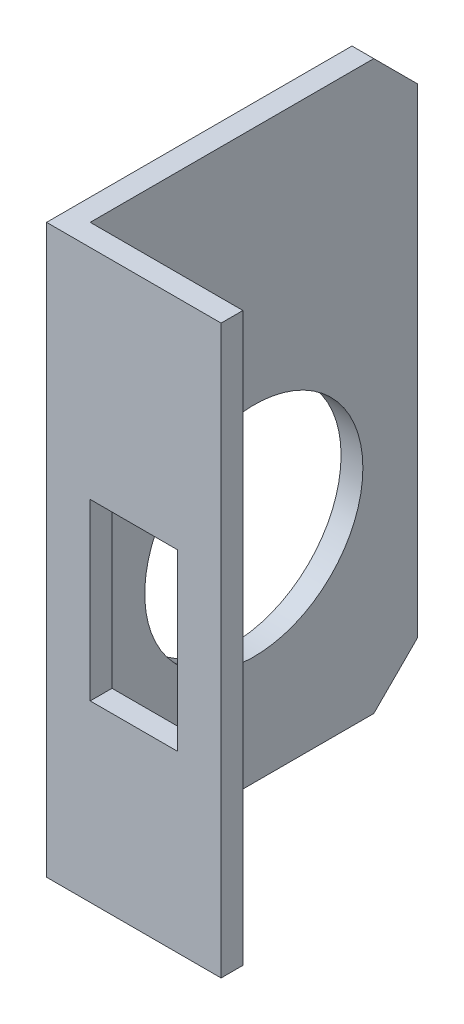
ISO-10303-21;
HEADER;
FILE_DESCRIPTION(('STEP AP214'),'2;1');
FILE_NAME('part.step','',(''),(''),'','','');
FILE_SCHEMA(('AUTOMOTIVE_DESIGN { 1 0 10303 214 1 1 1 1 }'));
ENDSEC;
DATA;
#1=APPLICATION_CONTEXT('core data for automotive mechanical design processes');
#2=APPLICATION_PROTOCOL_DEFINITION('international standard','automotive_design',2000,#1);
#3=PRODUCT_CONTEXT('',#1,'mechanical');
#4=PRODUCT('Part','Part','',(#3));
#5=PRODUCT_RELATED_PRODUCT_CATEGORY('part','',(#4));
#6=PRODUCT_DEFINITION_FORMATION('','',#4);
#7=PRODUCT_DEFINITION_CONTEXT('part definition',#1,'design');
#8=PRODUCT_DEFINITION('design','',#6,#7);
#9=PRODUCT_DEFINITION_SHAPE('','',#8);
#10=(LENGTH_UNIT() NAMED_UNIT(*) SI_UNIT(.MILLI.,.METRE.));
#11=(NAMED_UNIT(*) PLANE_ANGLE_UNIT() SI_UNIT($,.RADIAN.));
#12=(NAMED_UNIT(*) SI_UNIT($,.STERADIAN.) SOLID_ANGLE_UNIT());
#13=UNCERTAINTY_MEASURE_WITH_UNIT(LENGTH_MEASURE(1.E-05),#10,'distance_accuracy_value','');
#14=(GEOMETRIC_REPRESENTATION_CONTEXT(3) GLOBAL_UNCERTAINTY_ASSIGNED_CONTEXT((#13)) GLOBAL_UNIT_ASSIGNED_CONTEXT((#10,
#11,#12)) REPRESENTATION_CONTEXT('',''));
#15=CARTESIAN_POINT('',(0.,0.,0.));
#16=DIRECTION('',(0.,0.,1.));
#17=DIRECTION('',(1.,0.,0.));
#18=AXIS2_PLACEMENT_3D('',#15,#16,#17);
#19=CARTESIAN_POINT('',(0.,-38.1,-1.5875));
#20=DIRECTION('',(0.,0.,-1.));
#21=DIRECTION('',(-1.,0.,0.));
#22=AXIS2_PLACEMENT_3D('',#19,#20,#21);
#23=PLANE('',#22);
#24=DIRECTION('',(1.,0.,0.));
#25=VECTOR('',#24,1.);
#26=CARTESIAN_POINT('',(6.35000000000001,-12.7,-1.5875));
#27=LINE('',#26,#25);
#28=CARTESIAN_POINT('',(-6.35,-12.7,-1.5875));
#29=VERTEX_POINT('',#28);
#30=CARTESIAN_POINT('',(6.35,-12.7,-1.5875));
#31=VERTEX_POINT('',#30);
#32=EDGE_CURVE('E142',#29,#31,#27,.T.);
#33=ORIENTED_EDGE('',*,*,#32,.T.);
#34=DIRECTION('',(0.,1.,0.));
#35=VECTOR('',#34,1.);
#36=CARTESIAN_POINT('',(6.35,12.7,-1.5875));
#37=LINE('',#36,#35);
#38=CARTESIAN_POINT('',(6.35,12.7,-1.5875));
#39=VERTEX_POINT('',#38);
#40=EDGE_CURVE('E129',#31,#39,#37,.T.);
#41=ORIENTED_EDGE('',*,*,#40,.T.);
#42=DIRECTION('',(-1.,0.,0.));
#43=VECTOR('',#42,1.);
#44=CARTESIAN_POINT('',(6.35,12.7,-1.5875));
#45=LINE('',#44,#43);
#46=CARTESIAN_POINT('',(-6.35,12.7,-1.5875));
#47=VERTEX_POINT('',#46);
#48=EDGE_CURVE('E159',#39,#47,#45,.T.);
#49=ORIENTED_EDGE('',*,*,#48,.T.);
#50=DIRECTION('',(0.,-1.,0.));
#51=VECTOR('',#50,1.);
#52=CARTESIAN_POINT('',(-6.35,12.7,-1.5875));
#53=LINE('',#52,#51);
#54=EDGE_CURVE('E149',#47,#29,#53,.T.);
#55=ORIENTED_EDGE('',*,*,#54,.T.);
#56=EDGE_LOOP('',(#33,#41,#49,#55));
#57=FACE_BOUND('',#56,.T.);
#58=DIRECTION('',(0.,1.,0.));
#59=VECTOR('',#58,1.);
#60=CARTESIAN_POINT('',(-9.525,-38.1,-1.5875));
#61=LINE('',#60,#59);
#62=CARTESIAN_POINT('',(-9.525,-38.1,-1.5875));
#63=VERTEX_POINT('',#62);
#64=CARTESIAN_POINT('',(-9.525,44.45,-1.5875));
#65=VERTEX_POINT('',#64);
#66=EDGE_CURVE('E42',#63,#65,#61,.T.);
#67=ORIENTED_EDGE('',*,*,#66,.T.);
#68=DIRECTION('',(-1.,0.,0.));
#69=VECTOR('',#68,1.);
#70=CARTESIAN_POINT('',(0.,44.45,-1.5875));
#71=LINE('',#70,#69);
#72=CARTESIAN_POINT('',(12.7,44.45,-1.5875));
#73=VERTEX_POINT('',#72);
#74=EDGE_CURVE('E172',#73,#65,#71,.T.);
#75=ORIENTED_EDGE('',*,*,#74,.F.);
#76=DIRECTION('',(0.,1.,0.));
#77=VECTOR('',#76,1.);
#78=CARTESIAN_POINT('',(12.7,-38.1,-1.5875));
#79=LINE('',#78,#77);
#80=CARTESIAN_POINT('',(12.7,-38.1,-1.5875));
#81=VERTEX_POINT('',#80);
#82=EDGE_CURVE('E11',#81,#73,#79,.T.);
#83=ORIENTED_EDGE('',*,*,#82,.F.);
#84=DIRECTION('',(-1.,0.,0.));
#85=VECTOR('',#84,1.);
#86=CARTESIAN_POINT('',(0.,-38.1,-1.5875));
#87=LINE('',#86,#85);
#88=EDGE_CURVE('E203',#81,#63,#87,.T.);
#89=ORIENTED_EDGE('',*,*,#88,.T.);
#90=EDGE_LOOP('',(#67,#75,#83,#89));
#91=FACE_BOUND('',#90,.T.);
#92=ADVANCED_FACE('F39',(#57,#91),#23,.T.);
#93=CARTESIAN_POINT('',(12.7,-38.1,0.));
#94=DIRECTION('',(-1.,0.,0.));
#95=DIRECTION('',(0.,0.,1.));
#96=AXIS2_PLACEMENT_3D('',#93,#94,#95);
#97=PLANE('',#96);
#98=ORIENTED_EDGE('',*,*,#82,.T.);
#99=DIRECTION('',(0.,0.,1.));
#100=VECTOR('',#99,1.);
#101=CARTESIAN_POINT('',(12.7,44.45,0.));
#102=LINE('',#101,#100);
#103=CARTESIAN_POINT('',(12.7,44.45,1.5875));
#104=VERTEX_POINT('',#103);
#105=EDGE_CURVE('E200',#73,#104,#102,.T.);
#106=ORIENTED_EDGE('',*,*,#105,.T.);
#107=DIRECTION('',(0.,1.,0.));
#108=VECTOR('',#107,1.);
#109=CARTESIAN_POINT('',(12.7,-38.1,1.5875));
#110=LINE('',#109,#108);
#111=CARTESIAN_POINT('',(12.7,-38.1,1.5875));
#112=VERTEX_POINT('',#111);
#113=EDGE_CURVE('E47',#112,#104,#110,.T.);
#114=ORIENTED_EDGE('',*,*,#113,.F.);
#115=DIRECTION('',(0.,0.,1.));
#116=VECTOR('',#115,1.);
#117=CARTESIAN_POINT('',(12.7,-38.1,0.));
#118=LINE('',#117,#116);
#119=EDGE_CURVE('E213',#81,#112,#118,.T.);
#120=ORIENTED_EDGE('',*,*,#119,.F.);
#121=EDGE_LOOP('',(#98,#106,#114,#120));
#122=FACE_BOUND('',#121,.T.);
#123=ADVANCED_FACE('F240',(#122),#97,.F.);
#124=CARTESIAN_POINT('',(0.,-38.1,1.5875));
#125=DIRECTION('',(0.,0.,-1.));
#126=DIRECTION('',(-1.,0.,0.));
#127=AXIS2_PLACEMENT_3D('',#124,#125,#126);
#128=PLANE('',#127);
#129=DIRECTION('',(0.,1.,0.));
#130=VECTOR('',#129,1.);
#131=CARTESIAN_POINT('',(6.35,12.7,1.5875));
#132=LINE('',#131,#130);
#133=CARTESIAN_POINT('',(6.35,-12.7,1.5875));
#134=VERTEX_POINT('',#133);
#135=CARTESIAN_POINT('',(6.35,12.7,1.5875));
#136=VERTEX_POINT('',#135);
#137=EDGE_CURVE('E151',#134,#136,#132,.T.);
#138=ORIENTED_EDGE('',*,*,#137,.F.);
#139=DIRECTION('',(1.,0.,0.));
#140=VECTOR('',#139,1.);
#141=CARTESIAN_POINT('',(6.35,-12.7,1.5875));
#142=LINE('',#141,#140);
#143=CARTESIAN_POINT('',(-6.35,-12.7,1.5875));
#144=VERTEX_POINT('',#143);
#145=EDGE_CURVE('E145',#144,#134,#142,.T.);
#146=ORIENTED_EDGE('',*,*,#145,.F.);
#147=DIRECTION('',(0.,-1.,0.));
#148=VECTOR('',#147,1.);
#149=CARTESIAN_POINT('',(-6.35,12.7,1.5875));
#150=LINE('',#149,#148);
#151=CARTESIAN_POINT('',(-6.35,12.7,1.5875));
#152=VERTEX_POINT('',#151);
#153=EDGE_CURVE('E155',#152,#144,#150,.T.);
#154=ORIENTED_EDGE('',*,*,#153,.F.);
#155=DIRECTION('',(-1.,0.,0.));
#156=VECTOR('',#155,1.);
#157=CARTESIAN_POINT('',(6.35,12.7,1.5875));
#158=LINE('',#157,#156);
#159=EDGE_CURVE('E63',#136,#152,#158,.T.);
#160=ORIENTED_EDGE('',*,*,#159,.F.);
#161=EDGE_LOOP('',(#138,#146,#154,#160));
#162=FACE_BOUND('',#161,.T.);
#163=ORIENTED_EDGE('',*,*,#113,.T.);
#164=DIRECTION('',(-1.,0.,0.));
#165=VECTOR('',#164,1.);
#166=CARTESIAN_POINT('',(0.,44.45,1.5875));
#167=LINE('',#166,#165);
#168=CARTESIAN_POINT('',(-12.7,44.45,1.5875));
#169=VERTEX_POINT('',#168);
#170=EDGE_CURVE('E197',#104,#169,#167,.T.);
#171=ORIENTED_EDGE('',*,*,#170,.T.);
#172=DIRECTION('',(0.,1.,0.));
#173=VECTOR('',#172,1.);
#174=CARTESIAN_POINT('',(-12.7,-38.1,1.5875));
#175=LINE('',#174,#173);
#176=CARTESIAN_POINT('',(-12.7,-38.1,1.5875));
#177=VERTEX_POINT('',#176);
#178=EDGE_CURVE('E216',#177,#169,#175,.T.);
#179=ORIENTED_EDGE('',*,*,#178,.F.);
#180=DIRECTION('',(-1.,0.,0.));
#181=VECTOR('',#180,1.);
#182=CARTESIAN_POINT('',(0.,-38.1,1.5875));
#183=LINE('',#182,#181);
#184=EDGE_CURVE('E210',#112,#177,#183,.T.);
#185=ORIENTED_EDGE('',*,*,#184,.F.);
#186=EDGE_LOOP('',(#163,#171,#179,#185));
#187=FACE_BOUND('',#186,.T.);
#188=ADVANCED_FACE('F259',(#162,#187),#128,.F.);
#189=CARTESIAN_POINT('',(-12.7,-38.1,0.));
#190=DIRECTION('',(-1.,0.,0.));
#191=DIRECTION('',(0.,0.,1.));
#192=AXIS2_PLACEMENT_3D('',#189,#190,#191);
#193=PLANE('',#192);
#194=CARTESIAN_POINT('',(-12.7,-6.35,-25.4));
#195=DIRECTION('',(-1.,0.,0.));
#196=DIRECTION('',(0.,0.,1.));
#197=AXIS2_PLACEMENT_3D('',#194,#195,#196);
#198=CIRCLE('',#197,15.875);
#199=CARTESIAN_POINT('',(-12.7,-6.35,-41.275));
#200=VERTEX_POINT('',#199);
#201=EDGE_CURVE('E168',#200,#200,#198,.F.);
#202=ORIENTED_EDGE('',*,*,#201,.T.);
#203=EDGE_LOOP('',(#202));
#204=FACE_BOUND('',#203,.T.);
#205=DIRECTION('',(0.,-0.707106781186548,-0.707106781186548));
#206=VECTOR('',#205,1.);
#207=CARTESIAN_POINT('',(-12.7,38.1,-49.2125));
#208=LINE('',#207,#206);
#209=CARTESIAN_POINT('',(-12.7,44.45,-42.8625));
#210=VERTEX_POINT('',#209);
#211=CARTESIAN_POINT('',(-12.7,38.1,-49.2125));
#212=VERTEX_POINT('',#211);
#213=EDGE_CURVE('E175',#210,#212,#208,.T.);
#214=ORIENTED_EDGE('',*,*,#213,.T.);
#215=DIRECTION('',(0.,1.,0.));
#216=VECTOR('',#215,1.);
#217=CARTESIAN_POINT('',(-12.7,-38.1,-49.2125));
#218=LINE('',#217,#216);
#219=CARTESIAN_POINT('',(-12.7,-31.75,-49.2125));
#220=VERTEX_POINT('',#219);
#221=EDGE_CURVE('E219',#220,#212,#218,.T.);
#222=ORIENTED_EDGE('',*,*,#221,.F.);
#223=DIRECTION('',(0.,-0.707106781186548,0.707106781186547));
#224=VECTOR('',#223,1.);
#225=CARTESIAN_POINT('',(-12.7,-31.75,-49.2125));
#226=LINE('',#225,#224);
#227=CARTESIAN_POINT('',(-12.7,-38.1,-42.8625));
#228=VERTEX_POINT('',#227);
#229=EDGE_CURVE('E185',#220,#228,#226,.T.);
#230=ORIENTED_EDGE('',*,*,#229,.T.);
#231=DIRECTION('',(0.,0.,1.));
#232=VECTOR('',#231,1.);
#233=CARTESIAN_POINT('',(-12.7,-38.1,0.));
#234=LINE('',#233,#232);
#235=EDGE_CURVE('E208',#228,#177,#234,.T.);
#236=ORIENTED_EDGE('',*,*,#235,.T.);
#237=ORIENTED_EDGE('',*,*,#178,.T.);
#238=DIRECTION('',(0.,0.,1.));
#239=VECTOR('',#238,1.);
#240=CARTESIAN_POINT('',(-12.7,44.45,0.));
#241=LINE('',#240,#239);
#242=EDGE_CURVE('E195',#210,#169,#241,.T.);
#243=ORIENTED_EDGE('',*,*,#242,.F.);
#244=EDGE_LOOP('',(#214,#222,#230,#236,#237,#243));
#245=FACE_BOUND('',#244,.T.);
#246=ADVANCED_FACE('F256',(#204,#245),#193,.T.);
#247=CARTESIAN_POINT('',(-1.07552855510562E-13,-38.1,-49.2125));
#248=DIRECTION('',(0.,0.,-1.));
#249=DIRECTION('',(-1.,0.,0.));
#250=AXIS2_PLACEMENT_3D('',#247,#248,#249);
#251=PLANE('',#250);
#252=DIRECTION('',(1.,0.,0.));
#253=VECTOR('',#252,1.);
#254=CARTESIAN_POINT('',(-57.6012806053458,38.1,-49.2125));
#255=LINE('',#254,#253);
#256=CARTESIAN_POINT('',(-9.525,38.1,-49.2125));
#257=VERTEX_POINT('',#256);
#258=EDGE_CURVE('E176',#212,#257,#255,.T.);
#259=ORIENTED_EDGE('',*,*,#258,.T.);
#260=DIRECTION('',(0.,1.,0.));
#261=VECTOR('',#260,1.);
#262=CARTESIAN_POINT('',(-9.52500000000001,-38.1,-49.2125));
#263=LINE('',#262,#261);
#264=CARTESIAN_POINT('',(-9.525,-31.75,-49.2125));
#265=VERTEX_POINT('',#264);
#266=EDGE_CURVE('E221',#265,#257,#263,.T.);
#267=ORIENTED_EDGE('',*,*,#266,.F.);
#268=DIRECTION('',(1.,0.,0.));
#269=VECTOR('',#268,1.);
#270=CARTESIAN_POINT('',(-57.6012806053458,-31.75,-49.2125));
#271=LINE('',#270,#269);
#272=EDGE_CURVE('E186',#220,#265,#271,.T.);
#273=ORIENTED_EDGE('',*,*,#272,.F.);
#274=ORIENTED_EDGE('',*,*,#221,.T.);
#275=EDGE_LOOP('',(#259,#267,#273,#274));
#276=FACE_BOUND('',#275,.T.);
#277=ADVANCED_FACE('F250',(#276),#251,.T.);
#278=CARTESIAN_POINT('',(-9.525,-38.1,0.));
#279=DIRECTION('',(-1.,0.,0.));
#280=DIRECTION('',(0.,0.,1.));
#281=AXIS2_PLACEMENT_3D('',#278,#279,#280);
#282=PLANE('',#281);
#283=CARTESIAN_POINT('',(-9.525,-6.35,-25.4));
#284=DIRECTION('',(1.,0.,0.));
#285=DIRECTION('',(0.,0.,-1.));
#286=AXIS2_PLACEMENT_3D('',#283,#284,#285);
#287=CIRCLE('',#286,15.875);
#288=CARTESIAN_POINT('',(-9.52500000000001,-6.35,-41.275));
#289=VERTEX_POINT('',#288);
#290=EDGE_CURVE('E165',#289,#289,#287,.T.);
#291=ORIENTED_EDGE('',*,*,#290,.F.);
#292=EDGE_LOOP('',(#291));
#293=FACE_BOUND('',#292,.T.);
#294=ORIENTED_EDGE('',*,*,#266,.T.);
#295=DIRECTION('',(0.,-0.707106781186547,-0.707106781186547));
#296=VECTOR('',#295,1.);
#297=CARTESIAN_POINT('',(-9.525,38.1,-49.2125));
#298=LINE('',#297,#296);
#299=CARTESIAN_POINT('',(-9.525,44.45,-42.8625));
#300=VERTEX_POINT('',#299);
#301=EDGE_CURVE('E169',#300,#257,#298,.T.);
#302=ORIENTED_EDGE('',*,*,#301,.F.);
#303=DIRECTION('',(0.,0.,1.));
#304=VECTOR('',#303,1.);
#305=CARTESIAN_POINT('',(-9.525,44.45,0.));
#306=LINE('',#305,#304);
#307=EDGE_CURVE('E193',#300,#65,#306,.T.);
#308=ORIENTED_EDGE('',*,*,#307,.T.);
#309=ORIENTED_EDGE('',*,*,#66,.F.);
#310=DIRECTION('',(0.,0.,1.));
#311=VECTOR('',#310,1.);
#312=CARTESIAN_POINT('',(-9.525,-38.1,0.));
#313=LINE('',#312,#311);
#314=CARTESIAN_POINT('',(-9.525,-38.1,-42.8625));
#315=VERTEX_POINT('',#314);
#316=EDGE_CURVE('E206',#315,#63,#313,.T.);
#317=ORIENTED_EDGE('',*,*,#316,.F.);
#318=DIRECTION('',(0.,-0.707106781186548,0.707106781186547));
#319=VECTOR('',#318,1.);
#320=CARTESIAN_POINT('',(-9.525,-31.75,-49.2125));
#321=LINE('',#320,#319);
#322=EDGE_CURVE('E179',#265,#315,#321,.T.);
#323=ORIENTED_EDGE('',*,*,#322,.F.);
#324=EDGE_LOOP('',(#294,#302,#308,#309,#317,#323));
#325=FACE_BOUND('',#324,.T.);
#326=ADVANCED_FACE('F246',(#293,#325),#282,.F.);
#327=CARTESIAN_POINT('',(0.,-38.1,0.));
#328=DIRECTION('',(0.,1.,0.));
#329=DIRECTION('',(0.,0.,1.));
#330=AXIS2_PLACEMENT_3D('',#327,#328,#329);
#331=PLANE('',#330);
#332=ORIENTED_EDGE('',*,*,#235,.F.);
#333=DIRECTION('',(1.,0.,0.));
#334=VECTOR('',#333,1.);
#335=CARTESIAN_POINT('',(-57.6012806053458,-38.1,-42.8625));
#336=LINE('',#335,#334);
#337=EDGE_CURVE('E164',#228,#315,#336,.T.);
#338=ORIENTED_EDGE('',*,*,#337,.T.);
#339=ORIENTED_EDGE('',*,*,#316,.T.);
#340=ORIENTED_EDGE('',*,*,#88,.F.);
#341=ORIENTED_EDGE('',*,*,#119,.T.);
#342=ORIENTED_EDGE('',*,*,#184,.T.);
#343=EDGE_LOOP('',(#332,#338,#339,#340,#341,#342));
#344=FACE_BOUND('',#343,.T.);
#345=ADVANCED_FACE('F245',(#344),#331,.F.);
#346=CARTESIAN_POINT('',(0.,44.45,0.));
#347=DIRECTION('',(0.,1.,0.));
#348=DIRECTION('',(0.,0.,1.));
#349=AXIS2_PLACEMENT_3D('',#346,#347,#348);
#350=PLANE('',#349);
#351=DIRECTION('',(1.,0.,0.));
#352=VECTOR('',#351,1.);
#353=CARTESIAN_POINT('',(-57.6012806053458,44.45,-42.8625));
#354=LINE('',#353,#352);
#355=EDGE_CURVE('E173',#210,#300,#354,.T.);
#356=ORIENTED_EDGE('',*,*,#355,.F.);
#357=ORIENTED_EDGE('',*,*,#242,.T.);
#358=ORIENTED_EDGE('',*,*,#170,.F.);
#359=ORIENTED_EDGE('',*,*,#105,.F.);
#360=ORIENTED_EDGE('',*,*,#74,.T.);
#361=ORIENTED_EDGE('',*,*,#307,.F.);
#362=EDGE_LOOP('',(#356,#357,#358,#359,#360,#361));
#363=FACE_BOUND('',#362,.T.);
#364=ADVANCED_FACE('F236',(#363),#350,.T.);
#365=CARTESIAN_POINT('',(-57.6012806053458,38.1,-49.2125));
#366=DIRECTION('',(0.,-0.707106781186548,0.707106781186548));
#367=DIRECTION('',(0.,-0.707106781186548,-0.707106781186548));
#368=AXIS2_PLACEMENT_3D('',#365,#366,#367);
#369=PLANE('',#368);
#370=ORIENTED_EDGE('',*,*,#355,.T.);
#371=ORIENTED_EDGE('',*,*,#301,.T.);
#372=ORIENTED_EDGE('',*,*,#258,.F.);
#373=ORIENTED_EDGE('',*,*,#213,.F.);
#374=EDGE_LOOP('',(#370,#371,#372,#373));
#375=FACE_BOUND('',#374,.T.);
#376=ADVANCED_FACE('F253',(#375),#369,.F.);
#377=CARTESIAN_POINT('',(-57.6012806053458,-31.75,-49.2125));
#378=DIRECTION('',(0.,0.707106781186547,0.707106781186548));
#379=DIRECTION('',(0.,-0.707106781186548,0.707106781186547));
#380=AXIS2_PLACEMENT_3D('',#377,#378,#379);
#381=PLANE('',#380);
#382=ORIENTED_EDGE('',*,*,#272,.T.);
#383=ORIENTED_EDGE('',*,*,#322,.T.);
#384=ORIENTED_EDGE('',*,*,#337,.F.);
#385=ORIENTED_EDGE('',*,*,#229,.F.);
#386=EDGE_LOOP('',(#382,#383,#384,#385));
#387=FACE_BOUND('',#386,.T.);
#388=ADVANCED_FACE('F334',(#387),#381,.F.);
#389=CARTESIAN_POINT('',(-57.6012806053458,-6.35,-25.4));
#390=DIRECTION('',(1.,0.,0.));
#391=DIRECTION('',(0.,0.,-1.));
#392=AXIS2_PLACEMENT_3D('',#389,#390,#391);
#393=CYLINDRICAL_SURFACE('',#392,15.875);
#394=CARTESIAN_POINT('',(-9.52500000000001,-6.35,-41.275));
#395=CARTESIAN_POINT('',(-9.55807291666667,-6.35,-41.275));
#396=CARTESIAN_POINT('',(-9.59114583333334,-6.35,-41.275));
#397=CARTESIAN_POINT('',(-9.65729166666667,-6.35,-41.275));
#398=CARTESIAN_POINT('',(-9.69036458333334,-6.35,-41.275));
#399=CARTESIAN_POINT('',(-9.75651041666667,-6.35,-41.275));
#400=CARTESIAN_POINT('',(-9.78958333333334,-6.35,-41.275));
#401=CARTESIAN_POINT('',(-9.85572916666667,-6.35,-41.275));
#402=CARTESIAN_POINT('',(-9.88880208333334,-6.35,-41.275));
#403=CARTESIAN_POINT('',(-9.95494791666667,-6.35,-41.275));
#404=CARTESIAN_POINT('',(-9.98802083333334,-6.35,-41.275));
#405=CARTESIAN_POINT('',(-10.0541666666667,-6.35,-41.275));
#406=CARTESIAN_POINT('',(-10.0872395833333,-6.35,-41.275));
#407=CARTESIAN_POINT('',(-10.1533854166667,-6.35,-41.275));
#408=CARTESIAN_POINT('',(-10.1864583333333,-6.35,-41.275));
#409=CARTESIAN_POINT('',(-10.2526041666667,-6.35,-41.275));
#410=CARTESIAN_POINT('',(-10.2856770833333,-6.35,-41.275));
#411=CARTESIAN_POINT('',(-10.3518229166667,-6.35,-41.275));
#412=CARTESIAN_POINT('',(-10.3848958333333,-6.35,-41.275));
#413=CARTESIAN_POINT('',(-10.4510416666667,-6.35,-41.275));
#414=CARTESIAN_POINT('',(-10.4841145833333,-6.35,-41.275));
#415=CARTESIAN_POINT('',(-10.5502604166667,-6.35,-41.275));
#416=CARTESIAN_POINT('',(-10.5833333333333,-6.35,-41.275));
#417=CARTESIAN_POINT('',(-10.6494791666667,-6.35,-41.275));
#418=CARTESIAN_POINT('',(-10.6825520833333,-6.35,-41.275));
#419=CARTESIAN_POINT('',(-10.7486979166667,-6.35,-41.275));
#420=CARTESIAN_POINT('',(-10.7817708333333,-6.35,-41.275));
#421=CARTESIAN_POINT('',(-10.8479166666667,-6.35,-41.275));
#422=CARTESIAN_POINT('',(-10.8809895833333,-6.35,-41.275));
#423=CARTESIAN_POINT('',(-10.9471354166667,-6.35,-41.275));
#424=CARTESIAN_POINT('',(-10.9802083333333,-6.35,-41.275));
#425=CARTESIAN_POINT('',(-11.0463541666667,-6.35,-41.275));
#426=CARTESIAN_POINT('',(-11.0794270833333,-6.35,-41.275));
#427=CARTESIAN_POINT('',(-11.1455729166667,-6.35,-41.275));
#428=CARTESIAN_POINT('',(-11.1786458333333,-6.35,-41.275));
#429=CARTESIAN_POINT('',(-11.2447916666667,-6.35,-41.275));
#430=CARTESIAN_POINT('',(-11.2778645833333,-6.35,-41.275));
#431=CARTESIAN_POINT('',(-11.3440104166667,-6.35,-41.275));
#432=CARTESIAN_POINT('',(-11.3770833333333,-6.35,-41.275));
#433=CARTESIAN_POINT('',(-11.4432291666667,-6.35,-41.275));
#434=CARTESIAN_POINT('',(-11.4763020833333,-6.35,-41.275));
#435=CARTESIAN_POINT('',(-11.5424479166667,-6.35,-41.275));
#436=CARTESIAN_POINT('',(-11.5755208333333,-6.35,-41.275));
#437=CARTESIAN_POINT('',(-11.6416666666667,-6.35,-41.275));
#438=CARTESIAN_POINT('',(-11.6747395833333,-6.35,-41.275));
#439=CARTESIAN_POINT('',(-11.7408854166667,-6.35,-41.275));
#440=CARTESIAN_POINT('',(-11.7739583333333,-6.35,-41.275));
#441=CARTESIAN_POINT('',(-11.8401041666667,-6.35,-41.275));
#442=CARTESIAN_POINT('',(-11.8731770833333,-6.35,-41.275));
#443=CARTESIAN_POINT('',(-11.9393229166667,-6.35,-41.275));
#444=CARTESIAN_POINT('',(-11.9723958333333,-6.35,-41.275));
#445=CARTESIAN_POINT('',(-12.0385416666667,-6.35,-41.275));
#446=CARTESIAN_POINT('',(-12.0716145833333,-6.35,-41.275));
#447=CARTESIAN_POINT('',(-12.1377604166667,-6.35,-41.275));
#448=CARTESIAN_POINT('',(-12.1708333333333,-6.35,-41.275));
#449=CARTESIAN_POINT('',(-12.2369791666667,-6.35,-41.275));
#450=CARTESIAN_POINT('',(-12.2700520833333,-6.35,-41.275));
#451=CARTESIAN_POINT('',(-12.3361979166667,-6.35,-41.275));
#452=CARTESIAN_POINT('',(-12.3692708333333,-6.35,-41.275));
#453=CARTESIAN_POINT('',(-12.4354166666667,-6.35,-41.275));
#454=CARTESIAN_POINT('',(-12.4684895833333,-6.35,-41.275));
#455=CARTESIAN_POINT('',(-12.5346354166667,-6.35,-41.275));
#456=CARTESIAN_POINT('',(-12.5677083333333,-6.35,-41.275));
#457=CARTESIAN_POINT('',(-12.6338541666667,-6.35,-41.275));
#458=CARTESIAN_POINT('',(-12.6669270833333,-6.35,-41.275));
#459=CARTESIAN_POINT('',(-12.7,-6.35,-41.275));
#460=B_SPLINE_CURVE_WITH_KNOTS('',3,(#394,#395,#396,#397,#398,#399,#400,#401,#402,#403,#404,
#405,#406,#407,#408,#409,#410,#411,#412,#413,#414,#415,#416,#417,#418,#419,#420,#421,#422,#423,
#424,#425,#426,#427,#428,#429,#430,#431,#432,#433,#434,#435,#436,#437,#438,#439,#440,#441,#442,
#443,#444,#445,#446,#447,#448,#449,#450,#451,#452,#453,#454,#455,#456,#457,#458,#459),
.UNSPECIFIED.,.F.,.F.,(4,2,2,2,2,2,2,2,2,2,2,2,2,2,2,2,2,2,2,2,2,2,2,2,2,2,2,2,2,2,2,2,4),(0.,
0.0992187499999977,0.198437500000002,0.29765625,0.396874999999998,0.496093750000003,0.5953125,
0.694531249999998,0.793749999999996,0.892968750000001,0.992187499999998,1.09140625,1.190625,
1.28984375,1.3890625,1.48828125,1.5875,1.68671875,1.7859375,1.88515625,1.984375,2.08359375,
2.1828125,2.28203125,2.38125,2.48046875,2.5796875,2.67890624999999,2.778125,2.87734375,
2.97656249999999,3.07578125,3.175),.UNSPECIFIED.);
#461=EDGE_CURVE('BSEAM343',#289,#200,#460,.T.);
#462=ORIENTED_EDGE('',*,*,#290,.T.);
#463=ORIENTED_EDGE('',*,*,#201,.F.);
#464=ORIENTED_EDGE('',*,*,#461,.T.);
#465=ORIENTED_EDGE('',*,*,#461,.F.);
#466=EDGE_LOOP('',(#462,#464,#463,#465));
#467=FACE_BOUND('',#466,.T.);
#468=ADVANCED_FACE('F343',(#467),#393,.F.);
#469=CARTESIAN_POINT('',(6.35,-12.7,-29.9855633142473));
#470=DIRECTION('',(0.,-1.,0.));
#471=DIRECTION('',(1.,0.,0.));
#472=AXIS2_PLACEMENT_3D('',#469,#470,#471);
#473=PLANE('',#472);
#474=DIRECTION('',(0.,0.,1.));
#475=VECTOR('',#474,1.);
#476=CARTESIAN_POINT('',(-6.35,-12.7,-29.9855633142473));
#477=LINE('',#476,#475);
#478=EDGE_CURVE('E55',#29,#144,#477,.T.);
#479=ORIENTED_EDGE('',*,*,#478,.T.);
#480=ORIENTED_EDGE('',*,*,#145,.T.);
#481=DIRECTION('',(0.,0.,1.));
#482=VECTOR('',#481,1.);
#483=CARTESIAN_POINT('',(6.35,-12.7,-29.9855633142473));
#484=LINE('',#483,#482);
#485=EDGE_CURVE('E133',#31,#134,#484,.T.);
#486=ORIENTED_EDGE('',*,*,#485,.F.);
#487=ORIENTED_EDGE('',*,*,#32,.F.);
#488=EDGE_LOOP('',(#479,#480,#486,#487));
#489=FACE_BOUND('',#488,.T.);
#490=ADVANCED_FACE('F141',(#489),#473,.F.);
#491=CARTESIAN_POINT('',(6.35,12.7,-29.9855633142473));
#492=DIRECTION('',(1.,0.,0.));
#493=DIRECTION('',(0.,1.,0.));
#494=AXIS2_PLACEMENT_3D('',#491,#492,#493);
#495=PLANE('',#494);
#496=ORIENTED_EDGE('',*,*,#485,.T.);
#497=ORIENTED_EDGE('',*,*,#137,.T.);
#498=DIRECTION('',(0.,0.,1.));
#499=VECTOR('',#498,1.);
#500=CARTESIAN_POINT('',(6.35,12.7,-29.9855633142473));
#501=LINE('',#500,#499);
#502=EDGE_CURVE('E135',#39,#136,#501,.T.);
#503=ORIENTED_EDGE('',*,*,#502,.F.);
#504=ORIENTED_EDGE('',*,*,#40,.F.);
#505=EDGE_LOOP('',(#496,#497,#503,#504));
#506=FACE_BOUND('',#505,.T.);
#507=ADVANCED_FACE('F131',(#506),#495,.F.);
#508=CARTESIAN_POINT('',(6.35,12.7,-29.9855633142473));
#509=DIRECTION('',(0.,1.,0.));
#510=DIRECTION('',(-1.,0.,0.));
#511=AXIS2_PLACEMENT_3D('',#508,#509,#510);
#512=PLANE('',#511);
#513=ORIENTED_EDGE('',*,*,#502,.T.);
#514=ORIENTED_EDGE('',*,*,#159,.T.);
#515=DIRECTION('',(0.,0.,1.));
#516=VECTOR('',#515,1.);
#517=CARTESIAN_POINT('',(-6.35,12.7,-29.9855633142473));
#518=LINE('',#517,#516);
#519=EDGE_CURVE('E158',#47,#152,#518,.T.);
#520=ORIENTED_EDGE('',*,*,#519,.F.);
#521=ORIENTED_EDGE('',*,*,#48,.F.);
#522=EDGE_LOOP('',(#513,#514,#520,#521));
#523=FACE_BOUND('',#522,.T.);
#524=ADVANCED_FACE('F368',(#523),#512,.F.);
#525=CARTESIAN_POINT('',(-6.35,12.7,-29.9855633142473));
#526=DIRECTION('',(-1.,0.,0.));
#527=DIRECTION('',(0.,-1.,0.));
#528=AXIS2_PLACEMENT_3D('',#525,#526,#527);
#529=PLANE('',#528);
#530=ORIENTED_EDGE('',*,*,#519,.T.);
#531=ORIENTED_EDGE('',*,*,#153,.T.);
#532=ORIENTED_EDGE('',*,*,#478,.F.);
#533=ORIENTED_EDGE('',*,*,#54,.F.);
#534=EDGE_LOOP('',(#530,#531,#532,#533));
#535=FACE_BOUND('',#534,.T.);
#536=ADVANCED_FACE('F375',(#535),#529,.F.);
#537=CLOSED_SHELL('',(#92,#123,#188,#246,#277,#326,#345,#364,#376,#388,#468,#490,#507,#524,#536));
#538=MANIFOLD_SOLID_BREP('B2',#537);
#539=ADVANCED_BREP_SHAPE_REPRESENTATION('',(#18,#538),#14);
#540=SHAPE_DEFINITION_REPRESENTATION(#9,#539);
ENDSEC;
END-ISO-10303-21;
